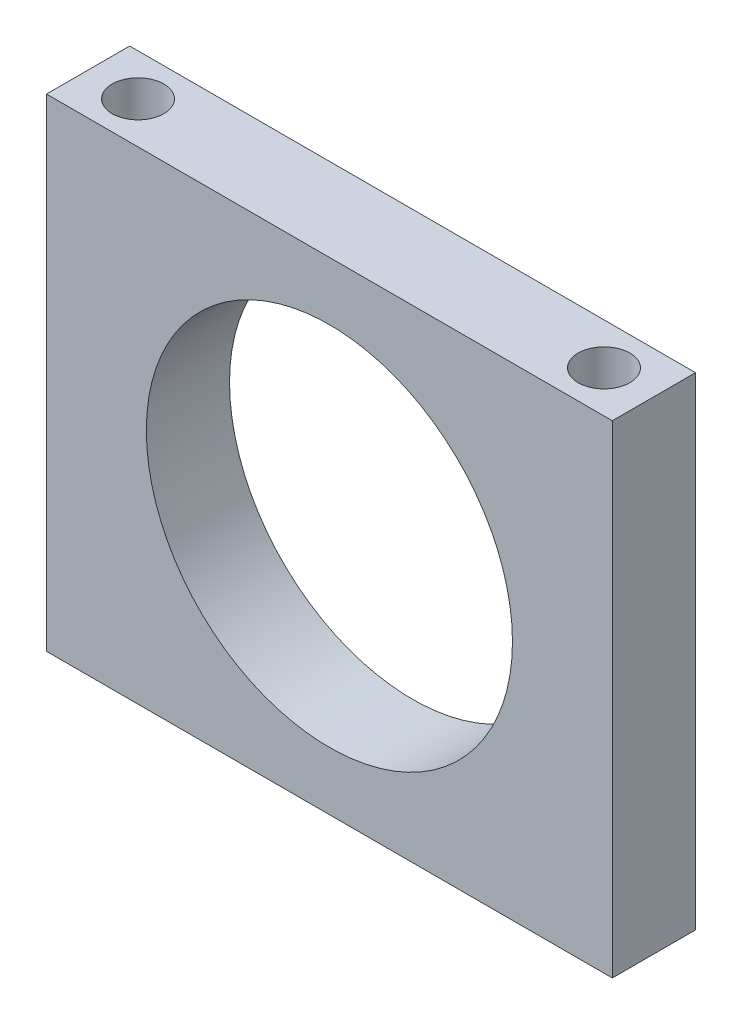
ISO-10303-21;
HEADER;
FILE_DESCRIPTION(('STEP AP214'),'2;1');
FILE_NAME('part.step','',(''),(''),'','','');
FILE_SCHEMA(('AUTOMOTIVE_DESIGN { 1 0 10303 214 1 1 1 1 }'));
ENDSEC;
DATA;
#1=APPLICATION_CONTEXT('core data for automotive mechanical design processes');
#2=APPLICATION_PROTOCOL_DEFINITION('international standard','automotive_design',2000,#1);
#3=PRODUCT_CONTEXT('',#1,'mechanical');
#4=PRODUCT('Part','Part','',(#3));
#5=PRODUCT_RELATED_PRODUCT_CATEGORY('part','',(#4));
#6=PRODUCT_DEFINITION_FORMATION('','',#4);
#7=PRODUCT_DEFINITION_CONTEXT('part definition',#1,'design');
#8=PRODUCT_DEFINITION('design','',#6,#7);
#9=PRODUCT_DEFINITION_SHAPE('','',#8);
#10=(LENGTH_UNIT() NAMED_UNIT(*) SI_UNIT(.MILLI.,.METRE.));
#11=(NAMED_UNIT(*) PLANE_ANGLE_UNIT() SI_UNIT($,.RADIAN.));
#12=(NAMED_UNIT(*) SI_UNIT($,.STERADIAN.) SOLID_ANGLE_UNIT());
#13=UNCERTAINTY_MEASURE_WITH_UNIT(LENGTH_MEASURE(1.E-05),#10,'distance_accuracy_value','');
#14=(GEOMETRIC_REPRESENTATION_CONTEXT(3) GLOBAL_UNCERTAINTY_ASSIGNED_CONTEXT((#13)) GLOBAL_UNIT_ASSIGNED_CONTEXT((#10,
#11,#12)) REPRESENTATION_CONTEXT('',''));
#15=CARTESIAN_POINT('',(0.,0.,0.));
#16=DIRECTION('',(0.,0.,1.));
#17=DIRECTION('',(1.,0.,0.));
#18=AXIS2_PLACEMENT_3D('',#15,#16,#17);
#19=CARTESIAN_POINT('',(0.,0.,5.));
#20=DIRECTION('',(0.,0.,-1.));
#21=DIRECTION('',(-1.,0.,0.));
#22=AXIS2_PLACEMENT_3D('',#19,#20,#21);
#23=PLANE('',#22);
#24=DIRECTION('',(0.,-1.,0.));
#25=VECTOR('',#24,1.);
#26=CARTESIAN_POINT('',(-17.,14.5,5.));
#27=LINE('',#26,#25);
#28=CARTESIAN_POINT('',(-17.,14.5,5.));
#29=VERTEX_POINT('',#28);
#30=CARTESIAN_POINT('',(-17.,-14.5,5.));
#31=VERTEX_POINT('',#30);
#32=EDGE_CURVE('E87',#29,#31,#27,.T.);
#33=ORIENTED_EDGE('',*,*,#32,.T.);
#34=DIRECTION('',(1.,0.,0.));
#35=VECTOR('',#34,1.);
#36=CARTESIAN_POINT('',(17.,-14.5,5.));
#37=LINE('',#36,#35);
#38=CARTESIAN_POINT('',(17.,-14.5,5.));
#39=VERTEX_POINT('',#38);
#40=EDGE_CURVE('E82',#31,#39,#37,.T.);
#41=ORIENTED_EDGE('',*,*,#40,.T.);
#42=DIRECTION('',(0.,1.,0.));
#43=VECTOR('',#42,1.);
#44=CARTESIAN_POINT('',(17.,14.5,5.));
#45=LINE('',#44,#43);
#46=CARTESIAN_POINT('',(17.,14.5,5.));
#47=VERTEX_POINT('',#46);
#48=EDGE_CURVE('E85',#39,#47,#45,.T.);
#49=ORIENTED_EDGE('',*,*,#48,.T.);
#50=DIRECTION('',(-1.,0.,0.));
#51=VECTOR('',#50,1.);
#52=CARTESIAN_POINT('',(17.,14.5,5.));
#53=LINE('',#52,#51);
#54=EDGE_CURVE('E52',#47,#29,#53,.T.);
#55=ORIENTED_EDGE('',*,*,#54,.T.);
#56=EDGE_LOOP('',(#33,#41,#49,#55));
#57=FACE_BOUND('',#56,.T.);
#58=CARTESIAN_POINT('',(0.,0.,5.));
#59=DIRECTION('',(0.,0.,1.));
#60=DIRECTION('',(1.,0.,0.));
#61=AXIS2_PLACEMENT_3D('',#58,#59,#60);
#62=CIRCLE('',#61,11.);
#63=CARTESIAN_POINT('',(11.,0.,5.));
#64=VERTEX_POINT('',#63);
#65=EDGE_CURVE('E102',#64,#64,#62,.T.);
#66=ORIENTED_EDGE('',*,*,#65,.F.);
#67=EDGE_LOOP('',(#66));
#68=FACE_BOUND('',#67,.T.);
#69=ADVANCED_FACE('F35',(#57,#68),#23,.F.);
#70=CARTESIAN_POINT('',(0.,0.,0.));
#71=DIRECTION('',(0.,0.,-1.));
#72=DIRECTION('',(-1.,0.,0.));
#73=AXIS2_PLACEMENT_3D('',#70,#71,#72);
#74=PLANE('',#73);
#75=DIRECTION('',(0.,-1.,0.));
#76=VECTOR('',#75,1.);
#77=CARTESIAN_POINT('',(-17.,14.5,0.));
#78=LINE('',#77,#76);
#79=CARTESIAN_POINT('',(-17.,14.5,0.));
#80=VERTEX_POINT('',#79);
#81=CARTESIAN_POINT('',(-17.,-14.5,0.));
#82=VERTEX_POINT('',#81);
#83=EDGE_CURVE('E99',#80,#82,#78,.T.);
#84=ORIENTED_EDGE('',*,*,#83,.F.);
#85=DIRECTION('',(-1.,0.,0.));
#86=VECTOR('',#85,1.);
#87=CARTESIAN_POINT('',(17.,14.5,0.));
#88=LINE('',#87,#86);
#89=CARTESIAN_POINT('',(17.,14.5,0.));
#90=VERTEX_POINT('',#89);
#91=EDGE_CURVE('E75',#90,#80,#88,.T.);
#92=ORIENTED_EDGE('',*,*,#91,.F.);
#93=DIRECTION('',(0.,1.,0.));
#94=VECTOR('',#93,1.);
#95=CARTESIAN_POINT('',(17.,14.5,0.));
#96=LINE('',#95,#94);
#97=CARTESIAN_POINT('',(17.,-14.5,0.));
#98=VERTEX_POINT('',#97);
#99=EDGE_CURVE('E69',#98,#90,#96,.T.);
#100=ORIENTED_EDGE('',*,*,#99,.F.);
#101=DIRECTION('',(1.,0.,0.));
#102=VECTOR('',#101,1.);
#103=CARTESIAN_POINT('',(17.,-14.5,0.));
#104=LINE('',#103,#102);
#105=EDGE_CURVE('E91',#82,#98,#104,.T.);
#106=ORIENTED_EDGE('',*,*,#105,.F.);
#107=EDGE_LOOP('',(#84,#92,#100,#106));
#108=FACE_BOUND('',#107,.T.);
#109=CARTESIAN_POINT('',(0.,0.,0.));
#110=DIRECTION('',(0.,0.,1.));
#111=DIRECTION('',(1.,0.,0.));
#112=AXIS2_PLACEMENT_3D('',#109,#110,#111);
#113=CIRCLE('',#112,11.);
#114=CARTESIAN_POINT('',(11.,0.,0.));
#115=VERTEX_POINT('',#114);
#116=EDGE_CURVE('E114',#115,#115,#113,.T.);
#117=ORIENTED_EDGE('',*,*,#116,.T.);
#118=EDGE_LOOP('',(#117));
#119=FACE_BOUND('',#118,.T.);
#120=ADVANCED_FACE('F110',(#108,#119),#74,.T.);
#121=CARTESIAN_POINT('',(-17.,14.5,5.));
#122=DIRECTION('',(1.,0.,0.));
#123=DIRECTION('',(0.,1.,0.));
#124=AXIS2_PLACEMENT_3D('',#121,#122,#123);
#125=PLANE('',#124);
#126=ORIENTED_EDGE('',*,*,#83,.T.);
#127=DIRECTION('',(0.,0.,-1.));
#128=VECTOR('',#127,1.);
#129=CARTESIAN_POINT('',(-17.,-14.5,5.));
#130=LINE('',#129,#128);
#131=EDGE_CURVE('E11',#31,#82,#130,.T.);
#132=ORIENTED_EDGE('',*,*,#131,.F.);
#133=ORIENTED_EDGE('',*,*,#32,.F.);
#134=DIRECTION('',(0.,0.,-1.));
#135=VECTOR('',#134,1.);
#136=CARTESIAN_POINT('',(-17.,14.5,5.));
#137=LINE('',#136,#135);
#138=EDGE_CURVE('E95',#29,#80,#137,.T.);
#139=ORIENTED_EDGE('',*,*,#138,.T.);
#140=EDGE_LOOP('',(#126,#132,#133,#139));
#141=FACE_BOUND('',#140,.T.);
#142=ADVANCED_FACE('F37',(#141),#125,.F.);
#143=CARTESIAN_POINT('',(17.,-14.5,5.));
#144=DIRECTION('',(0.,1.,0.));
#145=DIRECTION('',(-1.,0.,0.));
#146=AXIS2_PLACEMENT_3D('',#143,#144,#145);
#147=PLANE('',#146);
#148=CARTESIAN_POINT('',(-14.,-14.5,2.5));
#149=DIRECTION('',(0.,1.,0.));
#150=DIRECTION('',(0.,0.,1.));
#151=AXIS2_PLACEMENT_3D('',#148,#149,#150);
#152=CIRCLE('',#151,1.55000000000001);
#153=CARTESIAN_POINT('',(-14.,-14.5,4.05000000000001));
#154=VERTEX_POINT('',#153);
#155=EDGE_CURVE('E125',#154,#154,#152,.T.);
#156=ORIENTED_EDGE('',*,*,#155,.T.);
#157=EDGE_LOOP('',(#156));
#158=FACE_BOUND('',#157,.T.);
#159=CARTESIAN_POINT('',(14.,-14.5,2.5));
#160=DIRECTION('',(0.,1.,0.));
#161=DIRECTION('',(0.,0.,1.));
#162=AXIS2_PLACEMENT_3D('',#159,#160,#161);
#163=CIRCLE('',#162,1.55000000000001);
#164=CARTESIAN_POINT('',(14.,-14.5,4.05000000000001));
#165=VERTEX_POINT('',#164);
#166=EDGE_CURVE('E117',#165,#165,#163,.T.);
#167=ORIENTED_EDGE('',*,*,#166,.T.);
#168=EDGE_LOOP('',(#167));
#169=FACE_BOUND('',#168,.T.);
#170=ORIENTED_EDGE('',*,*,#105,.T.);
#171=DIRECTION('',(0.,0.,-1.));
#172=VECTOR('',#171,1.);
#173=CARTESIAN_POINT('',(17.,-14.5,5.));
#174=LINE('',#173,#172);
#175=EDGE_CURVE('E44',#39,#98,#174,.T.);
#176=ORIENTED_EDGE('',*,*,#175,.F.);
#177=ORIENTED_EDGE('',*,*,#40,.F.);
#178=ORIENTED_EDGE('',*,*,#131,.T.);
#179=EDGE_LOOP('',(#170,#176,#177,#178));
#180=FACE_BOUND('',#179,.T.);
#181=ADVANCED_FACE('F90',(#158,#169,#180),#147,.F.);
#182=CARTESIAN_POINT('',(17.,14.5,5.));
#183=DIRECTION('',(-1.,0.,0.));
#184=DIRECTION('',(0.,-1.,0.));
#185=AXIS2_PLACEMENT_3D('',#182,#183,#184);
#186=PLANE('',#185);
#187=ORIENTED_EDGE('',*,*,#99,.T.);
#188=DIRECTION('',(0.,0.,-1.));
#189=VECTOR('',#188,1.);
#190=CARTESIAN_POINT('',(17.,14.5,5.));
#191=LINE('',#190,#189);
#192=EDGE_CURVE('E92',#47,#90,#191,.T.);
#193=ORIENTED_EDGE('',*,*,#192,.F.);
#194=ORIENTED_EDGE('',*,*,#48,.F.);
#195=ORIENTED_EDGE('',*,*,#175,.T.);
#196=EDGE_LOOP('',(#187,#193,#194,#195));
#197=FACE_BOUND('',#196,.T.);
#198=ADVANCED_FACE('F93',(#197),#186,.F.);
#199=CARTESIAN_POINT('',(17.,14.5,5.));
#200=DIRECTION('',(0.,-1.,0.));
#201=DIRECTION('',(1.,0.,0.));
#202=AXIS2_PLACEMENT_3D('',#199,#200,#201);
#203=PLANE('',#202);
#204=CARTESIAN_POINT('',(-14.,14.5,2.5));
#205=DIRECTION('',(0.,1.,0.));
#206=DIRECTION('',(0.,0.,1.));
#207=AXIS2_PLACEMENT_3D('',#204,#205,#206);
#208=CIRCLE('',#207,1.55000000000001);
#209=CARTESIAN_POINT('',(-14.,14.5,4.05000000000001));
#210=VERTEX_POINT('',#209);
#211=EDGE_CURVE('E128',#210,#210,#208,.T.);
#212=ORIENTED_EDGE('',*,*,#211,.F.);
#213=EDGE_LOOP('',(#212));
#214=FACE_BOUND('',#213,.T.);
#215=CARTESIAN_POINT('',(14.,14.5,2.5));
#216=DIRECTION('',(0.,1.,0.));
#217=DIRECTION('',(0.,0.,1.));
#218=AXIS2_PLACEMENT_3D('',#215,#216,#217);
#219=CIRCLE('',#218,1.55000000000001);
#220=CARTESIAN_POINT('',(14.,14.5,4.05000000000001));
#221=VERTEX_POINT('',#220);
#222=EDGE_CURVE('E122',#221,#221,#219,.T.);
#223=ORIENTED_EDGE('',*,*,#222,.F.);
#224=EDGE_LOOP('',(#223));
#225=FACE_BOUND('',#224,.T.);
#226=ORIENTED_EDGE('',*,*,#91,.T.);
#227=ORIENTED_EDGE('',*,*,#138,.F.);
#228=ORIENTED_EDGE('',*,*,#54,.F.);
#229=ORIENTED_EDGE('',*,*,#192,.T.);
#230=EDGE_LOOP('',(#226,#227,#228,#229));
#231=FACE_BOUND('',#230,.T.);
#232=ADVANCED_FACE('F107',(#214,#225,#231),#203,.F.);
#233=CARTESIAN_POINT('',(0.,0.,5.));
#234=DIRECTION('',(0.,0.,-1.));
#235=DIRECTION('',(-1.,0.,0.));
#236=AXIS2_PLACEMENT_3D('',#233,#234,#235);
#237=CYLINDRICAL_SURFACE('',#236,11.);
#238=ORIENTED_EDGE('',*,*,#65,.T.);
#239=EDGE_LOOP('',(#238));
#240=FACE_BOUND('',#239,.T.);
#241=ORIENTED_EDGE('',*,*,#116,.F.);
#242=EDGE_LOOP('',(#241));
#243=FACE_BOUND('',#242,.T.);
#244=ADVANCED_FACE('F136',(#240,#243),#237,.F.);
#245=CARTESIAN_POINT('',(14.,14.5,2.5));
#246=DIRECTION('',(0.,1.,0.));
#247=DIRECTION('',(0.,0.,1.));
#248=AXIS2_PLACEMENT_3D('',#245,#246,#247);
#249=CYLINDRICAL_SURFACE('',#248,1.55000000000001);
#250=ORIENTED_EDGE('',*,*,#166,.F.);
#251=EDGE_LOOP('',(#250));
#252=FACE_BOUND('',#251,.T.);
#253=ORIENTED_EDGE('',*,*,#222,.T.);
#254=EDGE_LOOP('',(#253));
#255=FACE_BOUND('',#254,.T.);
#256=ADVANCED_FACE('F140',(#252,#255),#249,.F.);
#257=CARTESIAN_POINT('',(-14.,14.5,2.5));
#258=DIRECTION('',(0.,1.,0.));
#259=DIRECTION('',(0.,0.,1.));
#260=AXIS2_PLACEMENT_3D('',#257,#258,#259);
#261=CYLINDRICAL_SURFACE('',#260,1.55000000000001);
#262=ORIENTED_EDGE('',*,*,#155,.F.);
#263=EDGE_LOOP('',(#262));
#264=FACE_BOUND('',#263,.T.);
#265=ORIENTED_EDGE('',*,*,#211,.T.);
#266=EDGE_LOOP('',(#265));
#267=FACE_BOUND('',#266,.T.);
#268=ADVANCED_FACE('F132',(#264,#267),#261,.F.);
#269=CLOSED_SHELL('',(#69,#120,#142,#181,#198,#232,#244,#256,#268));
#270=MANIFOLD_SOLID_BREP('B2',#269);
#271=ADVANCED_BREP_SHAPE_REPRESENTATION('',(#18,#270),#14);
#272=SHAPE_DEFINITION_REPRESENTATION(#9,#271);
ENDSEC;
END-ISO-10303-21;
